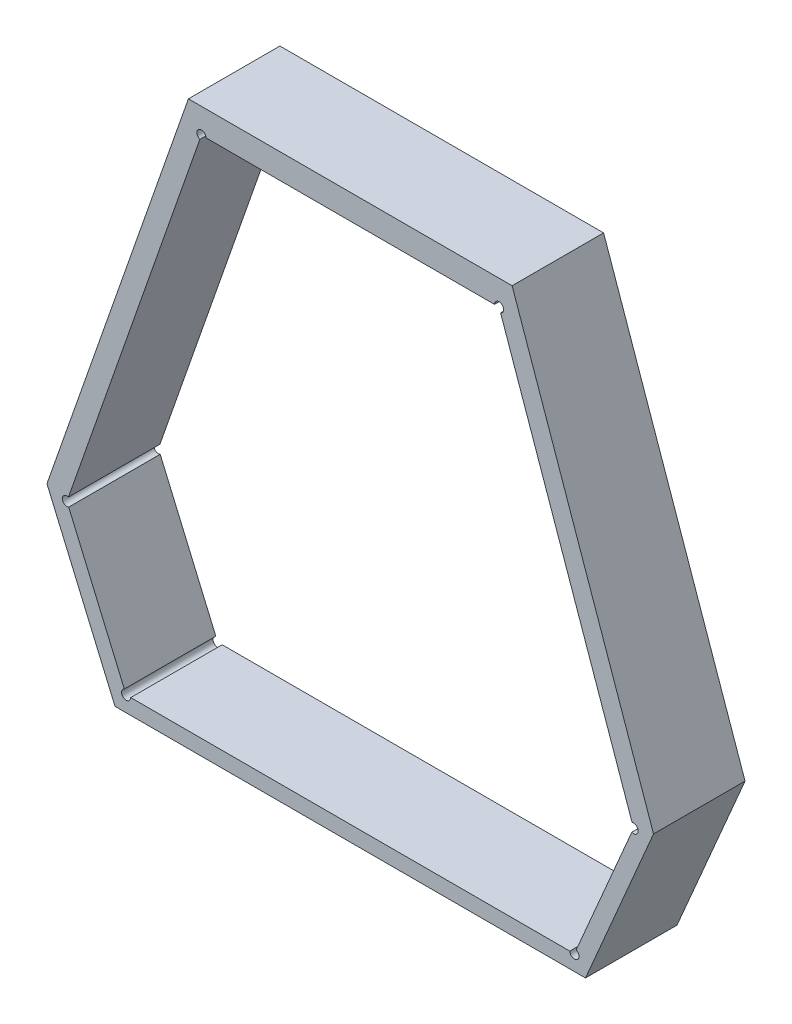
ISO-10303-21;
HEADER;
FILE_DESCRIPTION(('STEP AP214'),'2;1');
FILE_NAME('part.step','',(''),(''),'','','');
FILE_SCHEMA(('AUTOMOTIVE_DESIGN { 1 0 10303 214 1 1 1 1 }'));
ENDSEC;
DATA;
#1=APPLICATION_CONTEXT('core data for automotive mechanical design processes');
#2=APPLICATION_PROTOCOL_DEFINITION('international standard','automotive_design',2000,#1);
#3=PRODUCT_CONTEXT('',#1,'mechanical');
#4=PRODUCT('Part','Part','',(#3));
#5=PRODUCT_RELATED_PRODUCT_CATEGORY('part','',(#4));
#6=PRODUCT_DEFINITION_FORMATION('','',#4);
#7=PRODUCT_DEFINITION_CONTEXT('part definition',#1,'design');
#8=PRODUCT_DEFINITION('design','',#6,#7);
#9=PRODUCT_DEFINITION_SHAPE('','',#8);
#10=(LENGTH_UNIT() NAMED_UNIT(*) SI_UNIT(.MILLI.,.METRE.));
#11=(NAMED_UNIT(*) PLANE_ANGLE_UNIT() SI_UNIT($,.RADIAN.));
#12=(NAMED_UNIT(*) SI_UNIT($,.STERADIAN.) SOLID_ANGLE_UNIT());
#13=UNCERTAINTY_MEASURE_WITH_UNIT(LENGTH_MEASURE(1.E-05),#10,'distance_accuracy_value','');
#14=(GEOMETRIC_REPRESENTATION_CONTEXT(3) GLOBAL_UNCERTAINTY_ASSIGNED_CONTEXT((#13)) GLOBAL_UNIT_ASSIGNED_CONTEXT((#10,
#11,#12)) REPRESENTATION_CONTEXT('',''));
#15=CARTESIAN_POINT('',(0.,0.,0.));
#16=DIRECTION('',(0.,0.,1.));
#17=DIRECTION('',(1.,0.,0.));
#18=AXIS2_PLACEMENT_3D('',#15,#16,#17);
#19=CARTESIAN_POINT('',(-1.293997717,-1.377509868132,0.1));
#20=DIRECTION('',(0.,0.,1.));
#21=DIRECTION('',(-1.,0.,0.));
#22=AXIS2_PLACEMENT_3D('',#19,#20,#21);
#23=CYLINDRICAL_SURFACE('',#22,0.00500000000000003);
#24=DIRECTION('',(0.,0.,1.));
#25=VECTOR('',#24,1.);
#26=CARTESIAN_POINT('',(-1.292028162675,-1.37291412491,0.1));
#27=LINE('',#26,#25);
#28=CARTESIAN_POINT('',(-1.292028162675,-1.37291412491,0.));
#29=VERTEX_POINT('',#28);
#30=CARTESIAN_POINT('',(-1.292028162675,-1.37291412491,0.1));
#31=VERTEX_POINT('',#30);
#32=EDGE_CURVE('E11',#29,#31,#27,.T.);
#33=ORIENTED_EDGE('',*,*,#32,.F.);
#34=CARTESIAN_POINT('',(-1.293997717,-1.377509868132,0.));
#35=DIRECTION('',(0.,0.,1.));
#36=DIRECTION('',(-1.,0.,0.));
#37=AXIS2_PLACEMENT_3D('',#34,#35,#36);
#38=CIRCLE('',#37,0.00500000000000003);
#39=CARTESIAN_POINT('',(-1.298997717,-1.377509868132,0.));
#40=VERTEX_POINT('',#39);
#41=EDGE_CURVE('E24',#40,#29,#38,.T.);
#42=ORIENTED_EDGE('',*,*,#41,.F.);
#43=DIRECTION('',(0.,0.,-1.));
#44=VECTOR('',#43,1.);
#45=CARTESIAN_POINT('',(-1.298997717,-1.377509868132,0.1));
#46=LINE('',#45,#44);
#47=CARTESIAN_POINT('',(-1.298997717,-1.377509868132,0.1));
#48=VERTEX_POINT('',#47);
#49=EDGE_CURVE('E282',#48,#40,#46,.T.);
#50=ORIENTED_EDGE('',*,*,#49,.F.);
#51=CARTESIAN_POINT('',(-1.293997717,-1.377509868132,0.1));
#52=DIRECTION('',(0.,0.,-1.));
#53=DIRECTION('',(-1.,0.,0.));
#54=AXIS2_PLACEMENT_3D('',#51,#52,#53);
#55=CIRCLE('',#54,0.00500000000000003);
#56=EDGE_CURVE('E37',#31,#48,#55,.T.);
#57=ORIENTED_EDGE('',*,*,#56,.F.);
#58=EDGE_LOOP('',(#33,#42,#50,#57));
#59=FACE_BOUND('',#58,.T.);
#60=ADVANCED_FACE('F17',(#59),#23,.F.);
#61=CARTESIAN_POINT('',(-1.848667050412,-1.22650919463,0.1));
#62=DIRECTION('',(0.,0.,1.));
#63=DIRECTION('',(-1.,0.,0.));
#64=AXIS2_PLACEMENT_3D('',#61,#62,#63);
#65=CYLINDRICAL_SURFACE('',#64,0.00499999999999994);
#66=DIRECTION('',(0.,0.,-1.));
#67=VECTOR('',#66,1.);
#68=CARTESIAN_POINT('',(-1.847015073131,-1.22178998166,0.1));
#69=LINE('',#68,#67);
#70=CARTESIAN_POINT('',(-1.847015073131,-1.22178998166,0.1));
#71=VERTEX_POINT('',#70);
#72=CARTESIAN_POINT('',(-1.847015073131,-1.22178998166,0.));
#73=VERTEX_POINT('',#72);
#74=EDGE_CURVE('E278',#71,#73,#69,.T.);
#75=ORIENTED_EDGE('',*,*,#74,.F.);
#76=CARTESIAN_POINT('',(-1.848667050412,-1.22650919463,0.1));
#77=DIRECTION('',(0.,0.,-1.));
#78=DIRECTION('',(-1.,0.,0.));
#79=AXIS2_PLACEMENT_3D('',#76,#77,#78);
#80=CIRCLE('',#79,0.00499999999999994);
#81=CARTESIAN_POINT('',(-1.846697496087,-1.231104937852,0.1));
#82=VERTEX_POINT('',#81);
#83=EDGE_CURVE('E276',#82,#71,#80,.T.);
#84=ORIENTED_EDGE('',*,*,#83,.F.);
#85=DIRECTION('',(0.,0.,1.));
#86=VECTOR('',#85,1.);
#87=CARTESIAN_POINT('',(-1.846697496087,-1.231104937852,0.1));
#88=LINE('',#87,#86);
#89=CARTESIAN_POINT('',(-1.846697496087,-1.231104937852,0.));
#90=VERTEX_POINT('',#89);
#91=EDGE_CURVE('E274',#90,#82,#88,.T.);
#92=ORIENTED_EDGE('',*,*,#91,.F.);
#93=CARTESIAN_POINT('',(-1.848667050412,-1.22650919463,0.));
#94=DIRECTION('',(0.,0.,1.));
#95=DIRECTION('',(-1.,0.,0.));
#96=AXIS2_PLACEMENT_3D('',#93,#94,#95);
#97=CIRCLE('',#96,0.00499999999999994);
#98=EDGE_CURVE('E272',#73,#90,#97,.T.);
#99=ORIENTED_EDGE('',*,*,#98,.F.);
#100=EDGE_LOOP('',(#75,#84,#92,#99));
#101=FACE_BOUND('',#100,.T.);
#102=ADVANCED_FACE('F329',(#101),#65,.F.);
#103=CARTESIAN_POINT('',(-1.376302875285,-0.806521766430921,0.1));
#104=DIRECTION('',(0.,0.,1.));
#105=DIRECTION('',(-1.,0.,0.));
#106=AXIS2_PLACEMENT_3D('',#103,#104,#105);
#107=CYLINDRICAL_SURFACE('',#106,0.00500000000000005);
#108=DIRECTION('',(0.,0.,1.));
#109=VECTOR('',#108,1.);
#110=CARTESIAN_POINT('',(-1.381302875285,-0.806521766430921,0.1));
#111=LINE('',#110,#109);
#112=CARTESIAN_POINT('',(-1.381302875285,-0.806521766430921,0.));
#113=VERTEX_POINT('',#112);
#114=CARTESIAN_POINT('',(-1.381302875285,-0.806521766430921,0.1));
#115=VERTEX_POINT('',#114);
#116=EDGE_CURVE('E269',#113,#115,#111,.T.);
#117=ORIENTED_EDGE('',*,*,#116,.F.);
#118=CARTESIAN_POINT('',(-1.376302875285,-0.806521766430921,0.));
#119=DIRECTION('',(0.,0.,1.));
#120=DIRECTION('',(-1.,0.,0.));
#121=AXIS2_PLACEMENT_3D('',#118,#119,#120);
#122=CIRCLE('',#121,0.00500000000000005);
#123=CARTESIAN_POINT('',(-1.374650898003,-0.811240979401511,0.));
#124=VERTEX_POINT('',#123);
#125=EDGE_CURVE('E267',#124,#113,#122,.T.);
#126=ORIENTED_EDGE('',*,*,#125,.F.);
#127=DIRECTION('',(0.,0.,-1.));
#128=VECTOR('',#127,1.);
#129=CARTESIAN_POINT('',(-1.374650898003,-0.811240979401511,0.1));
#130=LINE('',#129,#128);
#131=CARTESIAN_POINT('',(-1.374650898003,-0.811240979401511,0.1));
#132=VERTEX_POINT('',#131);
#133=EDGE_CURVE('E265',#132,#124,#130,.T.);
#134=ORIENTED_EDGE('',*,*,#133,.F.);
#135=CARTESIAN_POINT('',(-1.376302875285,-0.806521766430921,0.1));
#136=DIRECTION('',(0.,0.,-1.));
#137=DIRECTION('',(-1.,0.,0.));
#138=AXIS2_PLACEMENT_3D('',#135,#136,#137);
#139=CIRCLE('',#138,0.00500000000000005);
#140=EDGE_CURVE('E263',#115,#132,#139,.T.);
#141=ORIENTED_EDGE('',*,*,#140,.F.);
#142=EDGE_LOOP('',(#117,#126,#134,#141));
#143=FACE_BOUND('',#142,.T.);
#144=ADVANCED_FACE('F310',(#143),#107,.F.);
#145=CARTESIAN_POINT('',(-1.701648957739,-0.806521766430921,0.1));
#146=DIRECTION('',(0.,0.,1.));
#147=DIRECTION('',(-1.,0.,0.));
#148=AXIS2_PLACEMENT_3D('',#145,#146,#147);
#149=CYLINDRICAL_SURFACE('',#148,0.00500000000000006);
#150=DIRECTION('',(0.,0.,-1.));
#151=VECTOR('',#150,1.);
#152=CARTESIAN_POINT('',(-1.696648957739,-0.806521766430921,0.1));
#153=LINE('',#152,#151);
#154=CARTESIAN_POINT('',(-1.696648957739,-0.806521766430921,0.1));
#155=VERTEX_POINT('',#154);
#156=CARTESIAN_POINT('',(-1.696648957739,-0.806521766430921,0.));
#157=VERTEX_POINT('',#156);
#158=EDGE_CURVE('E260',#155,#157,#153,.T.);
#159=ORIENTED_EDGE('',*,*,#158,.F.);
#160=CARTESIAN_POINT('',(-1.701648957739,-0.806521766430921,0.1));
#161=DIRECTION('',(0.,0.,-1.));
#162=DIRECTION('',(-1.,0.,0.));
#163=AXIS2_PLACEMENT_3D('',#160,#161,#162);
#164=CIRCLE('',#163,0.00500000000000006);
#165=CARTESIAN_POINT('',(-1.703300935021,-0.811240979401511,0.1));
#166=VERTEX_POINT('',#165);
#167=EDGE_CURVE('E258',#166,#155,#164,.T.);
#168=ORIENTED_EDGE('',*,*,#167,.F.);
#169=DIRECTION('',(0.,0.,1.));
#170=VECTOR('',#169,1.);
#171=CARTESIAN_POINT('',(-1.703300935021,-0.811240979401511,0.1));
#172=LINE('',#171,#170);
#173=CARTESIAN_POINT('',(-1.703300935021,-0.811240979401511,0.));
#174=VERTEX_POINT('',#173);
#175=EDGE_CURVE('E256',#174,#166,#172,.T.);
#176=ORIENTED_EDGE('',*,*,#175,.F.);
#177=CARTESIAN_POINT('',(-1.701648957739,-0.806521766430921,0.));
#178=DIRECTION('',(0.,0.,1.));
#179=DIRECTION('',(-1.,0.,0.));
#180=AXIS2_PLACEMENT_3D('',#177,#178,#179);
#181=CIRCLE('',#180,0.00500000000000006);
#182=EDGE_CURVE('E254',#157,#174,#181,.T.);
#183=ORIENTED_EDGE('',*,*,#182,.F.);
#184=EDGE_LOOP('',(#159,#168,#176,#183));
#185=FACE_BOUND('',#184,.T.);
#186=ADVANCED_FACE('F320',(#185),#149,.F.);
#187=CARTESIAN_POINT('',(-1.783954116023,-1.377509868132,0.1));
#188=DIRECTION('',(0.,0.,1.));
#189=DIRECTION('',(-1.,0.,0.));
#190=AXIS2_PLACEMENT_3D('',#187,#188,#189);
#191=CYLINDRICAL_SURFACE('',#190,0.00499999999999997);
#192=DIRECTION('',(0.,0.,1.));
#193=VECTOR('',#192,1.);
#194=CARTESIAN_POINT('',(-1.778954116023,-1.377509868132,0.1));
#195=LINE('',#194,#193);
#196=CARTESIAN_POINT('',(-1.778954116023,-1.377509868132,0.));
#197=VERTEX_POINT('',#196);
#198=CARTESIAN_POINT('',(-1.778954116023,-1.377509868132,0.1));
#199=VERTEX_POINT('',#198);
#200=EDGE_CURVE('E251',#197,#199,#195,.T.);
#201=ORIENTED_EDGE('',*,*,#200,.F.);
#202=CARTESIAN_POINT('',(-1.783954116023,-1.377509868132,0.));
#203=DIRECTION('',(0.,0.,1.));
#204=DIRECTION('',(-1.,0.,0.));
#205=AXIS2_PLACEMENT_3D('',#202,#203,#204);
#206=CIRCLE('',#205,0.00499999999999997);
#207=CARTESIAN_POINT('',(-1.785923670348,-1.37291412491,0.));
#208=VERTEX_POINT('',#207);
#209=EDGE_CURVE('E249',#208,#197,#206,.T.);
#210=ORIENTED_EDGE('',*,*,#209,.F.);
#211=DIRECTION('',(0.,0.,-1.));
#212=VECTOR('',#211,1.);
#213=CARTESIAN_POINT('',(-1.785923670348,-1.37291412491,0.1));
#214=LINE('',#213,#212);
#215=CARTESIAN_POINT('',(-1.785923670348,-1.37291412491,0.1));
#216=VERTEX_POINT('',#215);
#217=EDGE_CURVE('E247',#216,#208,#214,.T.);
#218=ORIENTED_EDGE('',*,*,#217,.F.);
#219=CARTESIAN_POINT('',(-1.783954116023,-1.377509868132,0.1));
#220=DIRECTION('',(0.,0.,-1.));
#221=DIRECTION('',(-1.,0.,0.));
#222=AXIS2_PLACEMENT_3D('',#219,#220,#221);
#223=CIRCLE('',#222,0.00499999999999997);
#224=EDGE_CURVE('E245',#199,#216,#223,.T.);
#225=ORIENTED_EDGE('',*,*,#224,.F.);
#226=EDGE_LOOP('',(#201,#210,#218,#225));
#227=FACE_BOUND('',#226,.T.);
#228=ADVANCED_FACE('F292',(#227),#191,.F.);
#229=CARTESIAN_POINT('',(-1.229284782612,-1.22650919463,0.1));
#230=DIRECTION('',(0.,0.,1.));
#231=DIRECTION('',(-1.,0.,0.));
#232=AXIS2_PLACEMENT_3D('',#229,#230,#231);
#233=CYLINDRICAL_SURFACE('',#232,0.00499999999999999);
#234=DIRECTION('',(0.,0.,1.));
#235=VECTOR('',#234,1.);
#236=CARTESIAN_POINT('',(-1.230936759893,-1.22178998166,0.1));
#237=LINE('',#236,#235);
#238=CARTESIAN_POINT('',(-1.230936759893,-1.22178998166,0.));
#239=VERTEX_POINT('',#238);
#240=CARTESIAN_POINT('',(-1.230936759893,-1.22178998166,0.1));
#241=VERTEX_POINT('',#240);
#242=EDGE_CURVE('E242',#239,#241,#237,.T.);
#243=ORIENTED_EDGE('',*,*,#242,.F.);
#244=CARTESIAN_POINT('',(-1.229284782612,-1.22650919463,0.));
#245=DIRECTION('',(0.,0.,1.));
#246=DIRECTION('',(-1.,0.,0.));
#247=AXIS2_PLACEMENT_3D('',#244,#245,#246);
#248=CIRCLE('',#247,0.00499999999999999);
#249=CARTESIAN_POINT('',(-1.231254336937,-1.231104937852,0.));
#250=VERTEX_POINT('',#249);
#251=EDGE_CURVE('E240',#250,#239,#248,.T.);
#252=ORIENTED_EDGE('',*,*,#251,.F.);
#253=DIRECTION('',(0.,0.,-1.));
#254=VECTOR('',#253,1.);
#255=CARTESIAN_POINT('',(-1.231254336937,-1.231104937852,0.1));
#256=LINE('',#255,#254);
#257=CARTESIAN_POINT('',(-1.231254336937,-1.231104937852,0.1));
#258=VERTEX_POINT('',#257);
#259=EDGE_CURVE('E238',#258,#250,#256,.T.);
#260=ORIENTED_EDGE('',*,*,#259,.F.);
#261=CARTESIAN_POINT('',(-1.229284782612,-1.22650919463,0.1));
#262=DIRECTION('',(0.,0.,-1.));
#263=DIRECTION('',(-1.,0.,0.));
#264=AXIS2_PLACEMENT_3D('',#261,#262,#263);
#265=CIRCLE('',#264,0.00499999999999999);
#266=EDGE_CURVE('E236',#241,#258,#265,.T.);
#267=ORIENTED_EDGE('',*,*,#266,.F.);
#268=EDGE_LOOP('',(#243,#252,#260,#267));
#269=FACE_BOUND('',#268,.T.);
#270=ADVANCED_FACE('F302',(#269),#233,.F.);
#271=CARTESIAN_POINT('',(-1.848667050412,-1.22650919463,0.));
#272=DIRECTION('',(-0.919148644359501,-0.393910865008941,0.));
#273=DIRECTION('',(0.393910865008941,-0.919148644359501,0.));
#274=AXIS2_PLACEMENT_3D('',#271,#272,#273);
#275=PLANE('',#274);
#276=ORIENTED_EDGE('',*,*,#91,.T.);
#277=DIRECTION('',(0.393910865008941,-0.919148644359501,0.));
#278=VECTOR('',#277,1.);
#279=CARTESIAN_POINT('',(-1.848667050412,-1.22650919463,0.1));
#280=LINE('',#279,#278);
#281=EDGE_CURVE('E233',#82,#216,#280,.T.);
#282=ORIENTED_EDGE('',*,*,#281,.T.);
#283=ORIENTED_EDGE('',*,*,#217,.T.);
#284=DIRECTION('',(0.393910865008941,-0.919148644359501,0.));
#285=VECTOR('',#284,1.);
#286=CARTESIAN_POINT('',(-1.848667050412,-1.22650919463,0.));
#287=LINE('',#286,#285);
#288=EDGE_CURVE('E230',#90,#208,#287,.T.);
#289=ORIENTED_EDGE('',*,*,#288,.F.);
#290=EDGE_LOOP('',(#276,#282,#283,#289));
#291=FACE_BOUND('',#290,.T.);
#292=ADVANCED_FACE('F331',(#291),#275,.F.);
#293=CARTESIAN_POINT('',(-1.293997717,-1.377509868132,0.));
#294=DIRECTION('',(0.,1.,0.));
#295=DIRECTION('',(-1.,0.,0.));
#296=AXIS2_PLACEMENT_3D('',#293,#294,#295);
#297=PLANE('',#296);
#298=ORIENTED_EDGE('',*,*,#49,.T.);
#299=DIRECTION('',(-1.,0.,0.));
#300=VECTOR('',#299,1.);
#301=CARTESIAN_POINT('',(-1.293997717,-1.377509868132,0.));
#302=LINE('',#301,#300);
#303=EDGE_CURVE('E227',#40,#197,#302,.T.);
#304=ORIENTED_EDGE('',*,*,#303,.T.);
#305=ORIENTED_EDGE('',*,*,#200,.T.);
#306=DIRECTION('',(-1.,0.,0.));
#307=VECTOR('',#306,1.);
#308=CARTESIAN_POINT('',(-1.293997717,-1.377509868132,0.1));
#309=LINE('',#308,#307);
#310=EDGE_CURVE('E224',#48,#199,#309,.T.);
#311=ORIENTED_EDGE('',*,*,#310,.F.);
#312=EDGE_LOOP('',(#298,#304,#305,#311));
#313=FACE_BOUND('',#312,.T.);
#314=ADVANCED_FACE('F285',(#313),#297,.T.);
#315=CARTESIAN_POINT('',(-1.345136512963,-1.111201730279,0.));
#316=DIRECTION('',(0.,0.,1.));
#317=DIRECTION('',(1.,0.,0.));
#318=AXIS2_PLACEMENT_3D('',#315,#316,#317);
#319=PLANE('',#318);
#320=DIRECTION('',(-1.,0.,0.));
#321=VECTOR('',#320,1.);
#322=CARTESIAN_POINT('',(-1.362067824991,-0.779218915312937,0.));
#323=LINE('',#322,#321);
#324=CARTESIAN_POINT('',(-1.362067824991,-0.779218915312937,0.));
#325=VERTEX_POINT('',#324);
#326=CARTESIAN_POINT('',(-1.715884008033,-0.779218915312937,0.));
#327=VERTEX_POINT('',#326);
#328=EDGE_CURVE('E222',#325,#327,#323,.T.);
#329=ORIENTED_EDGE('',*,*,#328,.F.);
#330=DIRECTION('',(-0.33039545627716,0.943842594118006,0.));
#331=VECTOR('',#330,1.);
#332=CARTESIAN_POINT('',(-1.207473789004,-1.220848584212,0.));
#333=LINE('',#332,#331);
#334=CARTESIAN_POINT('',(-1.207473789004,-1.220848584212,0.));
#335=VERTEX_POINT('',#334);
#336=EDGE_CURVE('E219',#335,#325,#333,.T.);
#337=ORIENTED_EDGE('',*,*,#336,.F.);
#338=DIRECTION('',(0.393910865008941,0.919148644359501,0.));
#339=VECTOR('',#338,1.);
#340=CARTESIAN_POINT('',(-1.281852349585,-1.394402957041,0.));
#341=LINE('',#340,#339);
#342=CARTESIAN_POINT('',(-1.281852349585,-1.394402957041,0.));
#343=VERTEX_POINT('',#342);
#344=EDGE_CURVE('E217',#343,#335,#341,.T.);
#345=ORIENTED_EDGE('',*,*,#344,.F.);
#346=DIRECTION('',(-1.,0.,0.));
#347=VECTOR('',#346,1.);
#348=CARTESIAN_POINT('',(-1.538975916512,-1.394402957041,0.));
#349=LINE('',#348,#347);
#350=CARTESIAN_POINT('',(-1.796099483439,-1.394402957041,0.));
#351=VERTEX_POINT('',#350);
#352=EDGE_CURVE('E159',#343,#351,#349,.T.);
#353=ORIENTED_EDGE('',*,*,#352,.T.);
#354=DIRECTION('',(-0.393910865008941,0.919148644359501,0.));
#355=VECTOR('',#354,1.);
#356=CARTESIAN_POINT('',(-1.796099483439,-1.394402957041,0.));
#357=LINE('',#356,#355);
#358=CARTESIAN_POINT('',(-1.87047804402,-1.220848584212,0.));
#359=VERTEX_POINT('',#358);
#360=EDGE_CURVE('E214',#351,#359,#357,.T.);
#361=ORIENTED_EDGE('',*,*,#360,.T.);
#362=DIRECTION('',(0.33039545627716,0.943842594118006,0.));
#363=VECTOR('',#362,1.);
#364=CARTESIAN_POINT('',(-1.87047804402,-1.220848584212,0.));
#365=LINE('',#364,#363);
#366=EDGE_CURVE('E211',#359,#327,#365,.T.);
#367=ORIENTED_EDGE('',*,*,#366,.T.);
#368=EDGE_LOOP('',(#329,#337,#345,#353,#361,#367));
#369=FACE_BOUND('',#368,.T.);
#370=ORIENTED_EDGE('',*,*,#41,.T.);
#371=DIRECTION('',(-0.393910865008941,-0.919148644359501,0.));
#372=VECTOR('',#371,1.);
#373=CARTESIAN_POINT('',(-1.229284782612,-1.22650919463,0.));
#374=LINE('',#373,#372);
#375=EDGE_CURVE('E208',#250,#29,#374,.T.);
#376=ORIENTED_EDGE('',*,*,#375,.F.);
#377=ORIENTED_EDGE('',*,*,#251,.T.);
#378=DIRECTION('',(0.330395456277161,-0.943842594118006,0.));
#379=VECTOR('',#378,1.);
#380=CARTESIAN_POINT('',(-1.376302875285,-0.806521766430921,0.));
#381=LINE('',#380,#379);
#382=EDGE_CURVE('E205',#124,#239,#381,.T.);
#383=ORIENTED_EDGE('',*,*,#382,.F.);
#384=ORIENTED_EDGE('',*,*,#125,.T.);
#385=DIRECTION('',(1.,0.,0.));
#386=VECTOR('',#385,1.);
#387=CARTESIAN_POINT('',(-1.538975916512,-0.806521766430921,0.));
#388=LINE('',#387,#386);
#389=EDGE_CURVE('E202',#157,#113,#388,.T.);
#390=ORIENTED_EDGE('',*,*,#389,.F.);
#391=ORIENTED_EDGE('',*,*,#182,.T.);
#392=DIRECTION('',(-0.330395456277161,-0.943842594118006,0.));
#393=VECTOR('',#392,1.);
#394=CARTESIAN_POINT('',(-1.701648957739,-0.806521766430921,0.));
#395=LINE('',#394,#393);
#396=EDGE_CURVE('E199',#174,#73,#395,.T.);
#397=ORIENTED_EDGE('',*,*,#396,.T.);
#398=ORIENTED_EDGE('',*,*,#98,.T.);
#399=ORIENTED_EDGE('',*,*,#288,.T.);
#400=ORIENTED_EDGE('',*,*,#209,.T.);
#401=ORIENTED_EDGE('',*,*,#303,.F.);
#402=EDGE_LOOP('',(#370,#376,#377,#383,#384,#390,#391,#397,#398,#399,#400,#401));
#403=FACE_BOUND('',#402,.T.);
#404=ADVANCED_FACE('F286',(#369,#403),#319,.F.);
#405=CARTESIAN_POINT('',(-1.376302875285,-0.806521766430921,0.));
#406=DIRECTION('',(-0.943842594118006,-0.330395456277161,0.));
#407=DIRECTION('',(0.330395456277161,-0.943842594118006,0.));
#408=AXIS2_PLACEMENT_3D('',#405,#406,#407);
#409=PLANE('',#408);
#410=ORIENTED_EDGE('',*,*,#133,.T.);
#411=ORIENTED_EDGE('',*,*,#382,.T.);
#412=ORIENTED_EDGE('',*,*,#242,.T.);
#413=DIRECTION('',(0.330395456277161,-0.943842594118006,0.));
#414=VECTOR('',#413,1.);
#415=CARTESIAN_POINT('',(-1.376302875285,-0.806521766430921,0.1));
#416=LINE('',#415,#414);
#417=EDGE_CURVE('E196',#132,#241,#416,.T.);
#418=ORIENTED_EDGE('',*,*,#417,.F.);
#419=EDGE_LOOP('',(#410,#411,#412,#418));
#420=FACE_BOUND('',#419,.T.);
#421=ADVANCED_FACE('F305',(#420),#409,.T.);
#422=CARTESIAN_POINT('',(-1.87047804402,-1.220848584212,0.));
#423=DIRECTION('',(0.943842594118006,-0.33039545627716,0.));
#424=DIRECTION('',(0.33039545627716,0.943842594118006,0.));
#425=AXIS2_PLACEMENT_3D('',#422,#423,#424);
#426=PLANE('',#425);
#427=ORIENTED_EDGE('',*,*,#366,.F.);
#428=DIRECTION('',(0.,0.,1.));
#429=VECTOR('',#428,1.);
#430=CARTESIAN_POINT('',(-1.87047804402,-1.220848584212,0.));
#431=LINE('',#430,#429);
#432=CARTESIAN_POINT('',(-1.87047804402,-1.220848584212,0.1));
#433=VERTEX_POINT('',#432);
#434=EDGE_CURVE('E194',#359,#433,#431,.T.);
#435=ORIENTED_EDGE('',*,*,#434,.T.);
#436=DIRECTION('',(0.33039545627716,0.943842594118006,0.));
#437=VECTOR('',#436,1.);
#438=CARTESIAN_POINT('',(-1.87047804402,-1.220848584212,0.1));
#439=LINE('',#438,#437);
#440=CARTESIAN_POINT('',(-1.715884008033,-0.779218915312937,0.1));
#441=VERTEX_POINT('',#440);
#442=EDGE_CURVE('E192',#433,#441,#439,.T.);
#443=ORIENTED_EDGE('',*,*,#442,.T.);
#444=DIRECTION('',(0.,0.,1.));
#445=VECTOR('',#444,1.);
#446=CARTESIAN_POINT('',(-1.715884008033,-0.779218915312937,0.));
#447=LINE('',#446,#445);
#448=EDGE_CURVE('E189',#327,#441,#447,.T.);
#449=ORIENTED_EDGE('',*,*,#448,.F.);
#450=EDGE_LOOP('',(#427,#435,#443,#449));
#451=FACE_BOUND('',#450,.T.);
#452=ADVANCED_FACE('F397',(#451),#426,.F.);
#453=CARTESIAN_POINT('',(-1.796099483439,-1.394402957041,0.));
#454=DIRECTION('',(0.919148644359501,0.393910865008941,0.));
#455=DIRECTION('',(-0.393910865008941,0.919148644359501,0.));
#456=AXIS2_PLACEMENT_3D('',#453,#454,#455);
#457=PLANE('',#456);
#458=ORIENTED_EDGE('',*,*,#360,.F.);
#459=DIRECTION('',(0.,0.,1.));
#460=VECTOR('',#459,1.);
#461=CARTESIAN_POINT('',(-1.796099483439,-1.394402957041,0.));
#462=LINE('',#461,#460);
#463=CARTESIAN_POINT('',(-1.796099483439,-1.394402957041,0.1));
#464=VERTEX_POINT('',#463);
#465=EDGE_CURVE('E187',#351,#464,#462,.T.);
#466=ORIENTED_EDGE('',*,*,#465,.T.);
#467=DIRECTION('',(-0.393910865008941,0.919148644359501,0.));
#468=VECTOR('',#467,1.);
#469=CARTESIAN_POINT('',(-1.796099483439,-1.394402957041,0.1));
#470=LINE('',#469,#468);
#471=EDGE_CURVE('E167',#464,#433,#470,.T.);
#472=ORIENTED_EDGE('',*,*,#471,.T.);
#473=ORIENTED_EDGE('',*,*,#434,.F.);
#474=EDGE_LOOP('',(#458,#466,#472,#473));
#475=FACE_BOUND('',#474,.T.);
#476=ADVANCED_FACE('F406',(#475),#457,.F.);
#477=CARTESIAN_POINT('',(-1.701648957739,-0.806521766430921,0.));
#478=DIRECTION('',(-0.943842594118006,0.330395456277161,0.));
#479=DIRECTION('',(-0.330395456277161,-0.943842594118006,0.));
#480=AXIS2_PLACEMENT_3D('',#477,#478,#479);
#481=PLANE('',#480);
#482=ORIENTED_EDGE('',*,*,#74,.T.);
#483=ORIENTED_EDGE('',*,*,#396,.F.);
#484=ORIENTED_EDGE('',*,*,#175,.T.);
#485=DIRECTION('',(-0.330395456277161,-0.943842594118006,0.));
#486=VECTOR('',#485,1.);
#487=CARTESIAN_POINT('',(-1.701648957739,-0.806521766430921,0.1));
#488=LINE('',#487,#486);
#489=EDGE_CURVE('E183',#166,#71,#488,.T.);
#490=ORIENTED_EDGE('',*,*,#489,.T.);
#491=EDGE_LOOP('',(#482,#483,#484,#490));
#492=FACE_BOUND('',#491,.T.);
#493=ADVANCED_FACE('F324',(#492),#481,.F.);
#494=CARTESIAN_POINT('',(-1.362067824991,-0.779218915312937,0.));
#495=DIRECTION('',(0.,1.,0.));
#496=DIRECTION('',(-1.,0.,0.));
#497=AXIS2_PLACEMENT_3D('',#494,#495,#496);
#498=PLANE('',#497);
#499=ORIENTED_EDGE('',*,*,#328,.T.);
#500=ORIENTED_EDGE('',*,*,#448,.T.);
#501=DIRECTION('',(-1.,0.,0.));
#502=VECTOR('',#501,1.);
#503=CARTESIAN_POINT('',(-1.362067824991,-0.779218915312937,0.1));
#504=LINE('',#503,#502);
#505=CARTESIAN_POINT('',(-1.362067824991,-0.779218915312937,0.1));
#506=VERTEX_POINT('',#505);
#507=EDGE_CURVE('E181',#506,#441,#504,.T.);
#508=ORIENTED_EDGE('',*,*,#507,.F.);
#509=DIRECTION('',(0.,0.,1.));
#510=VECTOR('',#509,1.);
#511=CARTESIAN_POINT('',(-1.362067824991,-0.779218915312937,0.));
#512=LINE('',#511,#510);
#513=EDGE_CURVE('E178',#325,#506,#512,.T.);
#514=ORIENTED_EDGE('',*,*,#513,.F.);
#515=EDGE_LOOP('',(#499,#500,#508,#514));
#516=FACE_BOUND('',#515,.T.);
#517=ADVANCED_FACE('F425',(#516),#498,.T.);
#518=CARTESIAN_POINT('',(-1.207473789004,-1.220848584212,0.));
#519=DIRECTION('',(0.943842594118006,0.33039545627716,0.));
#520=DIRECTION('',(-0.33039545627716,0.943842594118006,0.));
#521=AXIS2_PLACEMENT_3D('',#518,#519,#520);
#522=PLANE('',#521);
#523=ORIENTED_EDGE('',*,*,#336,.T.);
#524=ORIENTED_EDGE('',*,*,#513,.T.);
#525=DIRECTION('',(-0.33039545627716,0.943842594118006,0.));
#526=VECTOR('',#525,1.);
#527=CARTESIAN_POINT('',(-1.207473789004,-1.220848584212,0.1));
#528=LINE('',#527,#526);
#529=CARTESIAN_POINT('',(-1.207473789004,-1.220848584212,0.1));
#530=VERTEX_POINT('',#529);
#531=EDGE_CURVE('E176',#530,#506,#528,.T.);
#532=ORIENTED_EDGE('',*,*,#531,.F.);
#533=DIRECTION('',(0.,0.,1.));
#534=VECTOR('',#533,1.);
#535=CARTESIAN_POINT('',(-1.207473789004,-1.220848584212,0.));
#536=LINE('',#535,#534);
#537=EDGE_CURVE('E148',#335,#530,#536,.T.);
#538=ORIENTED_EDGE('',*,*,#537,.F.);
#539=EDGE_LOOP('',(#523,#524,#532,#538));
#540=FACE_BOUND('',#539,.T.);
#541=ADVANCED_FACE('F434',(#540),#522,.T.);
#542=CARTESIAN_POINT('',(-1.281852349585,-1.394402957041,0.));
#543=DIRECTION('',(0.919148644359501,-0.393910865008941,0.));
#544=DIRECTION('',(0.393910865008941,0.919148644359501,0.));
#545=AXIS2_PLACEMENT_3D('',#542,#543,#544);
#546=PLANE('',#545);
#547=ORIENTED_EDGE('',*,*,#344,.T.);
#548=ORIENTED_EDGE('',*,*,#537,.T.);
#549=DIRECTION('',(0.393910865008941,0.919148644359501,0.));
#550=VECTOR('',#549,1.);
#551=CARTESIAN_POINT('',(-1.281852349585,-1.394402957041,0.1));
#552=LINE('',#551,#550);
#553=CARTESIAN_POINT('',(-1.281852349585,-1.394402957041,0.1));
#554=VERTEX_POINT('',#553);
#555=EDGE_CURVE('E142',#554,#530,#552,.T.);
#556=ORIENTED_EDGE('',*,*,#555,.F.);
#557=DIRECTION('',(0.,0.,1.));
#558=VECTOR('',#557,1.);
#559=CARTESIAN_POINT('',(-1.281852349585,-1.394402957041,0.));
#560=LINE('',#559,#558);
#561=EDGE_CURVE('E146',#343,#554,#560,.T.);
#562=ORIENTED_EDGE('',*,*,#561,.F.);
#563=EDGE_LOOP('',(#547,#548,#556,#562));
#564=FACE_BOUND('',#563,.T.);
#565=ADVANCED_FACE('F145',(#564),#546,.T.);
#566=CARTESIAN_POINT('',(-1.538975916512,-1.394402957041,0.));
#567=DIRECTION('',(0.,-1.,0.));
#568=DIRECTION('',(1.,0.,0.));
#569=AXIS2_PLACEMENT_3D('',#566,#567,#568);
#570=PLANE('',#569);
#571=ORIENTED_EDGE('',*,*,#352,.F.);
#572=ORIENTED_EDGE('',*,*,#561,.T.);
#573=DIRECTION('',(-1.,0.,0.));
#574=VECTOR('',#573,1.);
#575=CARTESIAN_POINT('',(-1.538975916512,-1.394402957041,0.1));
#576=LINE('',#575,#574);
#577=EDGE_CURVE('E158',#554,#464,#576,.T.);
#578=ORIENTED_EDGE('',*,*,#577,.T.);
#579=ORIENTED_EDGE('',*,*,#465,.F.);
#580=EDGE_LOOP('',(#571,#572,#578,#579));
#581=FACE_BOUND('',#580,.T.);
#582=ADVANCED_FACE('F156',(#581),#570,.T.);
#583=CARTESIAN_POINT('',(-1.229284782612,-1.22650919463,0.));
#584=DIRECTION('',(-0.919148644359501,0.393910865008941,0.));
#585=DIRECTION('',(-0.393910865008941,-0.919148644359501,0.));
#586=AXIS2_PLACEMENT_3D('',#583,#584,#585);
#587=PLANE('',#586);
#588=ORIENTED_EDGE('',*,*,#32,.T.);
#589=DIRECTION('',(-0.393910865008941,-0.919148644359501,0.));
#590=VECTOR('',#589,1.);
#591=CARTESIAN_POINT('',(-1.229284782612,-1.22650919463,0.1));
#592=LINE('',#591,#590);
#593=EDGE_CURVE('E168',#258,#31,#592,.T.);
#594=ORIENTED_EDGE('',*,*,#593,.F.);
#595=ORIENTED_EDGE('',*,*,#259,.T.);
#596=ORIENTED_EDGE('',*,*,#375,.T.);
#597=EDGE_LOOP('',(#588,#594,#595,#596));
#598=FACE_BOUND('',#597,.T.);
#599=ADVANCED_FACE('F297',(#598),#587,.T.);
#600=CARTESIAN_POINT('',(-1.538975916512,-0.806521766430921,0.));
#601=DIRECTION('',(0.,-1.,0.));
#602=DIRECTION('',(1.,0.,0.));
#603=AXIS2_PLACEMENT_3D('',#600,#601,#602);
#604=PLANE('',#603);
#605=ORIENTED_EDGE('',*,*,#116,.T.);
#606=DIRECTION('',(-1.,0.,0.));
#607=VECTOR('',#606,1.);
#608=CARTESIAN_POINT('',(-1.538975916512,-0.806521766430921,0.1));
#609=LINE('',#608,#607);
#610=EDGE_CURVE('E171',#115,#155,#609,.T.);
#611=ORIENTED_EDGE('',*,*,#610,.T.);
#612=ORIENTED_EDGE('',*,*,#158,.T.);
#613=ORIENTED_EDGE('',*,*,#389,.T.);
#614=EDGE_LOOP('',(#605,#611,#612,#613));
#615=FACE_BOUND('',#614,.T.);
#616=ADVANCED_FACE('F314',(#615),#604,.T.);
#617=CARTESIAN_POINT('',(-1.345136512963,-1.111201730279,0.1));
#618=DIRECTION('',(0.,0.,1.));
#619=DIRECTION('',(1.,0.,0.));
#620=AXIS2_PLACEMENT_3D('',#617,#618,#619);
#621=PLANE('',#620);
#622=ORIENTED_EDGE('',*,*,#507,.T.);
#623=ORIENTED_EDGE('',*,*,#442,.F.);
#624=ORIENTED_EDGE('',*,*,#471,.F.);
#625=ORIENTED_EDGE('',*,*,#577,.F.);
#626=ORIENTED_EDGE('',*,*,#555,.T.);
#627=ORIENTED_EDGE('',*,*,#531,.T.);
#628=EDGE_LOOP('',(#622,#623,#624,#625,#626,#627));
#629=FACE_BOUND('',#628,.T.);
#630=ORIENTED_EDGE('',*,*,#56,.T.);
#631=ORIENTED_EDGE('',*,*,#310,.T.);
#632=ORIENTED_EDGE('',*,*,#224,.T.);
#633=ORIENTED_EDGE('',*,*,#281,.F.);
#634=ORIENTED_EDGE('',*,*,#83,.T.);
#635=ORIENTED_EDGE('',*,*,#489,.F.);
#636=ORIENTED_EDGE('',*,*,#167,.T.);
#637=ORIENTED_EDGE('',*,*,#610,.F.);
#638=ORIENTED_EDGE('',*,*,#140,.T.);
#639=ORIENTED_EDGE('',*,*,#417,.T.);
#640=ORIENTED_EDGE('',*,*,#266,.T.);
#641=ORIENTED_EDGE('',*,*,#593,.T.);
#642=EDGE_LOOP('',(#630,#631,#632,#633,#634,#635,#636,#637,#638,#639,#640,#641));
#643=FACE_BOUND('',#642,.T.);
#644=ADVANCED_FACE('F163',(#629,#643),#621,.T.);
#645=CLOSED_SHELL('',(#60,#102,#144,#186,#228,#270,#292,#314,#404,#421,#452,#476,#493,#517,#541,
#565,#582,#599,#616,#644));
#646=MANIFOLD_SOLID_BREP('B1',#645);
#647=ADVANCED_BREP_SHAPE_REPRESENTATION('',(#18,#646),#14);
#648=SHAPE_DEFINITION_REPRESENTATION(#9,#647);
ENDSEC;
END-ISO-10303-21;
